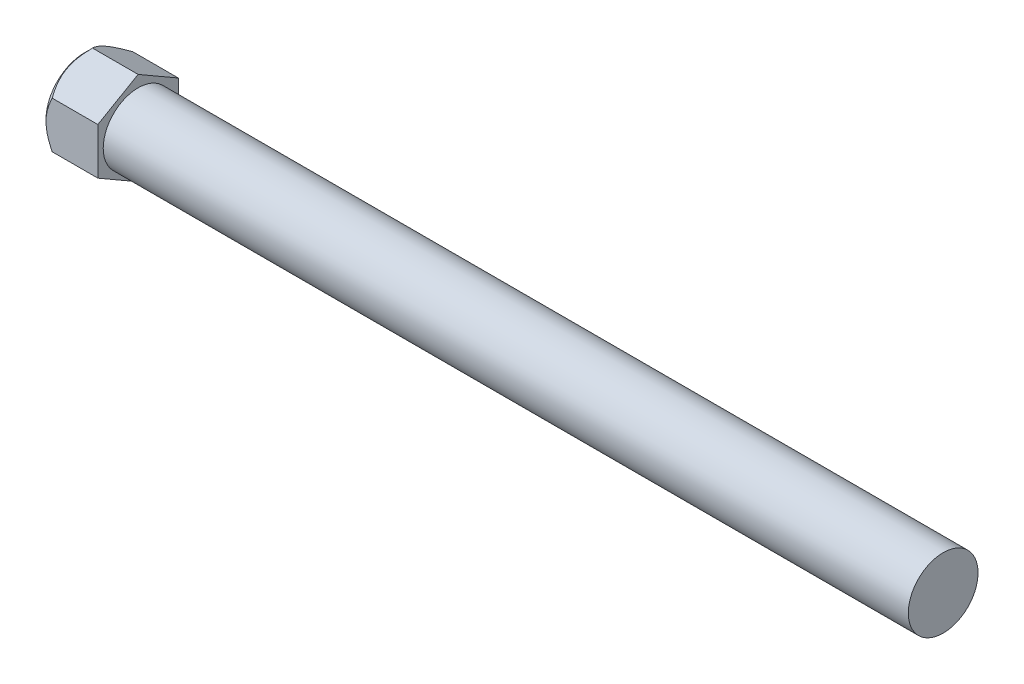
ISO-10303-21;
HEADER;
FILE_DESCRIPTION(('STEP AP214'),'2;1');
FILE_NAME('part.step','',(''),(''),'','','');
FILE_SCHEMA(('AUTOMOTIVE_DESIGN { 1 0 10303 214 1 1 1 1 }'));
ENDSEC;
DATA;
#1=APPLICATION_CONTEXT('core data for automotive mechanical design processes');
#2=APPLICATION_PROTOCOL_DEFINITION('international standard','automotive_design',2000,#1);
#3=PRODUCT_CONTEXT('',#1,'mechanical');
#4=PRODUCT('Part','Part','',(#3));
#5=PRODUCT_RELATED_PRODUCT_CATEGORY('part','',(#4));
#6=PRODUCT_DEFINITION_FORMATION('','',#4);
#7=PRODUCT_DEFINITION_CONTEXT('part definition',#1,'design');
#8=PRODUCT_DEFINITION('design','',#6,#7);
#9=PRODUCT_DEFINITION_SHAPE('','',#8);
#10=(LENGTH_UNIT() NAMED_UNIT(*) SI_UNIT(.MILLI.,.METRE.));
#11=(NAMED_UNIT(*) PLANE_ANGLE_UNIT() SI_UNIT($,.RADIAN.));
#12=(NAMED_UNIT(*) SI_UNIT($,.STERADIAN.) SOLID_ANGLE_UNIT());
#13=UNCERTAINTY_MEASURE_WITH_UNIT(LENGTH_MEASURE(1.E-05),#10,'distance_accuracy_value','');
#14=(GEOMETRIC_REPRESENTATION_CONTEXT(3) GLOBAL_UNCERTAINTY_ASSIGNED_CONTEXT((#13)) GLOBAL_UNIT_ASSIGNED_CONTEXT((#10,
#11,#12)) REPRESENTATION_CONTEXT('',''));
#15=CARTESIAN_POINT('',(0.,0.,0.));
#16=DIRECTION('',(0.,0.,1.));
#17=DIRECTION('',(1.,0.,0.));
#18=AXIS2_PLACEMENT_3D('',#15,#16,#17);
#19=CARTESIAN_POINT('',(5.08,-2.19970452561252,3.80999999999998));
#20=DIRECTION('',(0.,0.866025403784442,-0.499999999999995));
#21=DIRECTION('',(0.,0.499999999999995,0.866025403784442));
#22=AXIS2_PLACEMENT_3D('',#19,#20,#21);
#23=PLANE('',#22);
#24=DIRECTION('',(-1.,0.,0.));
#25=VECTOR('',#24,1.);
#26=CARTESIAN_POINT('',(5.08,-2.19970452561252,3.80999999999998));
#27=LINE('',#26,#25);
#28=CARTESIAN_POINT('',(5.08,-2.19970452561252,3.80999999999998));
#29=VERTEX_POINT('',#28);
#30=CARTESIAN_POINT('',(0.76199999999994,-2.19970452561252,3.80999999999998));
#31=VERTEX_POINT('',#30);
#32=EDGE_CURVE('E122',#29,#31,#27,.T.);
#33=ORIENTED_EDGE('',*,*,#32,.T.);
#34=CARTESIAN_POINT('',(0.762115474599724,-2.19958905555868,3.81019999999998));
#35=CARTESIAN_POINT('',(0.72429461384319,-2.23741368177178,3.74468582562159));
#36=CARTESIAN_POINT('',(0.687634073030057,-2.27552775566492,3.67867031315524));
#37=CARTESIAN_POINT('',(0.616987321907269,-2.35239442339124,3.54553333924474));
#38=CARTESIAN_POINT('',(0.583002572303398,-2.3911473522045,3.47841129759806));
#39=CARTESIAN_POINT('',(0.485302705892566,-2.50881394592998,3.27460677891196));
#40=CARTESIAN_POINT('',(0.426258823375215,-2.58872766346932,3.13619215991211));
#41=CARTESIAN_POINT('',(0.325143092756411,-2.74984883421759,2.85712210600113));
#42=CARTESIAN_POINT('',(0.282816609789215,-2.83101558859985,2.71653716352559));
#43=CARTESIAN_POINT('',(0.217598196192425,-2.99514139983759,2.43226291962837));
#44=CARTESIAN_POINT('',(0.194657606435888,-3.07809543004955,2.28858232460865));
#45=CARTESIAN_POINT('',(0.173959803408106,-3.22106315471624,2.04095496164341));
#46=CARTESIAN_POINT('',(0.170896533818308,-3.28089264638798,1.93732724227694));
#47=CARTESIAN_POINT('',(0.176060056540935,-3.40045452557853,1.73023999287049));
#48=CARTESIAN_POINT('',(0.184290806654918,-3.46018687170908,1.62678053451708));
#49=CARTESIAN_POINT('',(0.211572893911043,-3.57908559078563,1.42084191212165));
#50=CARTESIAN_POINT('',(0.230636333432986,-3.63825125532493,1.318363975076));
#51=CARTESIAN_POINT('',(0.278543161351629,-3.75556644772138,1.11516810134562));
#52=CARTESIAN_POINT('',(0.307385799906258,-3.81371605312778,1.01445003034165));
#53=CARTESIAN_POINT('',(0.366726884497841,-3.91694613462714,0.835650284315285));
#54=CARTESIAN_POINT('',(0.395665168807756,-3.96225515152759,0.757172765002717));
#55=CARTESIAN_POINT('',(0.458205410632379,-4.05205979679576,0.601626556642533));
#56=CARTESIAN_POINT('',(0.491807510083791,-4.09655540036174,0.524557910552823));
#57=CARTESIAN_POINT('',(0.562922095334091,-4.18459303244197,0.372072258811801));
#58=CARTESIAN_POINT('',(0.600422284646797,-4.22813756491547,0.296650916175872));
#59=CARTESIAN_POINT('',(0.678840604939881,-4.31442022588134,0.147204963570726));
#60=CARTESIAN_POINT('',(0.719756638840597,-4.35715882968172,0.073179530343918));
#61=CARTESIAN_POINT('',(0.762115474599705,-4.39952452127879,-0.000199999999999789));
#62=B_SPLINE_CURVE_WITH_KNOTS('',3,(#34,#35,#36,#37,#38,#39,#40,#41,#42,#43,#44,#45,#46,#47,#48,
#49,#50,#51,#52,#53,#54,#55,#56,#57,#58,#59,#60,#61),.UNSPECIFIED.,.F.,.F.,(4,2,2,2,2,2,2,2,2,2,
2,2,2,4),(0.,0.253711067376104,0.507559688133009,1.01799787781203,1.52033002790434,
2.02139753332799,2.37998555140283,2.73869926278797,3.09781452256132,3.45690225258971,
3.74214799282692,4.02740241602428,4.31178284720285,4.59598995563028),.UNSPECIFIED.);
#63=CARTESIAN_POINT('',(0.762,-4.39940905122503,1.36609473733174E-13));
#64=VERTEX_POINT('',#63);
#65=EDGE_CURVE('E62',#31,#64,#62,.T.);
#66=ORIENTED_EDGE('',*,*,#65,.T.);
#67=DIRECTION('',(-1.,0.,0.));
#68=VECTOR('',#67,1.);
#69=CARTESIAN_POINT('',(5.08,-4.39940905122495,0.));
#70=LINE('',#69,#68);
#71=CARTESIAN_POINT('',(5.08,-4.39940905122495,0.));
#72=VERTEX_POINT('',#71);
#73=EDGE_CURVE('E49',#72,#64,#70,.T.);
#74=ORIENTED_EDGE('',*,*,#73,.F.);
#75=DIRECTION('',(0.,-0.499999999999995,-0.866025403784441));
#76=VECTOR('',#75,1.);
#77=CARTESIAN_POINT('',(5.08,-2.19970452561252,3.80999999999998));
#78=LINE('',#77,#76);
#79=EDGE_CURVE('E150',#29,#72,#78,.T.);
#80=ORIENTED_EDGE('',*,*,#79,.F.);
#81=EDGE_LOOP('',(#33,#66,#74,#80));
#82=FACE_BOUND('',#81,.T.);
#83=ADVANCED_FACE('F45',(#82),#23,.F.);
#84=CARTESIAN_POINT('',(5.08,-4.39940905122495,0.));
#85=DIRECTION('',(0.,0.866025403784438,0.500000000000001));
#86=DIRECTION('',(0.,-0.500000000000001,0.866025403784438));
#87=AXIS2_PLACEMENT_3D('',#84,#85,#86);
#88=PLANE('',#87);
#89=ORIENTED_EDGE('',*,*,#73,.T.);
#90=CARTESIAN_POINT('',(0.762115474599704,-4.39952452127879,0.00020000000000005));
#91=CARTESIAN_POINT('',(0.724294613843171,-4.36169989506569,-0.0653141743783903));
#92=CARTESIAN_POINT('',(0.687634073030039,-4.32358582117255,-0.13132968684474));
#93=CARTESIAN_POINT('',(0.61698732190725,-4.24671915344623,-0.264466660755236));
#94=CARTESIAN_POINT('',(0.58300257230338,-4.20796622463297,-0.331588702401909));
#95=CARTESIAN_POINT('',(0.485302705892548,-4.09029963090748,-0.535393221088015));
#96=CARTESIAN_POINT('',(0.426258823375198,-4.01038591336814,-0.673807840087859));
#97=CARTESIAN_POINT('',(0.325143092756394,-3.84926474261988,-0.95287789399884));
#98=CARTESIAN_POINT('',(0.282816609789199,-3.76809798823762,-1.09346283647437));
#99=CARTESIAN_POINT('',(0.217598196192409,-3.60397217699988,-1.3777370803716));
#100=CARTESIAN_POINT('',(0.194657606435873,-3.52101814678792,-1.52141767539131));
#101=CARTESIAN_POINT('',(0.173959803408091,-3.37805042212123,-1.76904503835654));
#102=CARTESIAN_POINT('',(0.170896533818292,-3.31822093044949,-1.87267275772302));
#103=CARTESIAN_POINT('',(0.176060056540919,-3.19865905125893,-2.07976000712946));
#104=CARTESIAN_POINT('',(0.184290806654902,-3.13892670512838,-2.18321946548287));
#105=CARTESIAN_POINT('',(0.211572893911028,-3.02002798605184,-2.3891580878783));
#106=CARTESIAN_POINT('',(0.23063633343297,-2.96086232151253,-2.49163602492395));
#107=CARTESIAN_POINT('',(0.278543161351612,-2.84354712911608,-2.69483189865433));
#108=CARTESIAN_POINT('',(0.307385799906241,-2.78539752370968,-2.7955499696583));
#109=CARTESIAN_POINT('',(0.366726884497826,-2.68216744221032,-2.97434971568467));
#110=CARTESIAN_POINT('',(0.395665168807743,-2.63685842530987,-3.05282723499724));
#111=CARTESIAN_POINT('',(0.458205410632371,-2.54705378004168,-3.20837344335744));
#112=CARTESIAN_POINT('',(0.491807510083786,-2.50255817647571,-3.28544208944715));
#113=CARTESIAN_POINT('',(0.562922095334092,-2.41452054439547,-3.43792774118818));
#114=CARTESIAN_POINT('',(0.600422284646802,-2.37097601192197,-3.51334908382412));
#115=CARTESIAN_POINT('',(0.678840604939893,-2.28469335095608,-3.66279503642927));
#116=CARTESIAN_POINT('',(0.719756638840613,-2.2419547471557,-3.73682046965609));
#117=CARTESIAN_POINT('',(0.762115474599725,-2.19958905555863,-3.81020000000001));
#118=B_SPLINE_CURVE_WITH_KNOTS('',3,(#90,#91,#92,#93,#94,#95,#96,#97,#98,#99,#100,#101,#102,
#103,#104,#105,#106,#107,#108,#109,#110,#111,#112,#113,#114,#115,#116,#117),.UNSPECIFIED.,.F.,
.F.,(4,2,2,2,2,2,2,2,2,2,2,2,2,4),(0.,0.253711067376103,0.507559688133006,1.01799787781202,
1.52033002790433,2.02139753332798,2.37998555140281,2.73869926278795,3.0978145225613,
3.45690225258969,3.74214799282692,4.0274024160243,4.31178284720289,4.59598995563034),.UNSPECIFIED.);
#119=CARTESIAN_POINT('',(0.762,-2.19970452561259,-3.81000000000001));
#120=VERTEX_POINT('',#119);
#121=EDGE_CURVE('E146',#64,#120,#118,.T.);
#122=ORIENTED_EDGE('',*,*,#121,.T.);
#123=DIRECTION('',(-1.,0.,0.));
#124=VECTOR('',#123,1.);
#125=CARTESIAN_POINT('',(5.08,-2.19970452561247,-3.81000000000001));
#126=LINE('',#125,#124);
#127=CARTESIAN_POINT('',(5.08,-2.19970452561247,-3.81000000000001));
#128=VERTEX_POINT('',#127);
#129=EDGE_CURVE('E133',#128,#120,#126,.T.);
#130=ORIENTED_EDGE('',*,*,#129,.F.);
#131=DIRECTION('',(0.,0.500000000000001,-0.866025403784438));
#132=VECTOR('',#131,1.);
#133=CARTESIAN_POINT('',(5.08,-4.39940905122495,0.));
#134=LINE('',#133,#132);
#135=EDGE_CURVE('E147',#72,#128,#134,.T.);
#136=ORIENTED_EDGE('',*,*,#135,.F.);
#137=EDGE_LOOP('',(#89,#122,#130,#136));
#138=FACE_BOUND('',#137,.T.);
#139=ADVANCED_FACE('F145',(#138),#88,.F.);
#140=CARTESIAN_POINT('',(5.08,-2.19970452561247,-3.81000000000001));
#141=DIRECTION('',(0.,0.,1.));
#142=DIRECTION('',(0.,-1.,0.));
#143=AXIS2_PLACEMENT_3D('',#140,#141,#142);
#144=PLANE('',#143);
#145=ORIENTED_EDGE('',*,*,#129,.T.);
#146=CARTESIAN_POINT('',(4.03956213103374,-6.6648170667492,-3.81000000000002));
#147=CARTESIAN_POINT('',(3.95406082681038,-6.56632848536769,-3.81000000000002));
#148=CARTESIAN_POINT('',(3.86882290686694,-6.46761122441616,-3.81000000000002));
#149=CARTESIAN_POINT('',(3.69894774789053,-6.26965853860511,-3.81000000000002));
#150=CARTESIAN_POINT('',(3.61431051870555,-6.17042310529653,-3.81000000000002));
#151=CARTESIAN_POINT('',(3.36133739951288,-5.87176165356924,-3.81000000000002));
#152=CARTESIAN_POINT('',(3.19401884856488,-5.6714709499725,-3.81000000000002));
#153=CARTESIAN_POINT('',(2.85916182354779,-5.26338886415251,-3.81000000000002));
#154=CARTESIAN_POINT('',(2.69170473501833,-5.05553045898891,-3.81000000000002));
#155=CARTESIAN_POINT('',(2.36184013885293,-4.63591596038524,-3.81000000000002));
#156=CARTESIAN_POINT('',(2.1994313784785,-4.42416085501058,-3.81000000000002));
#157=CARTESIAN_POINT('',(1.88134314903491,-3.99516716202927,-3.81000000000001));
#158=CARTESIAN_POINT('',(1.72567276894562,-3.77792175796818,-3.81000000000001));
#159=CARTESIAN_POINT('',(1.49969327393704,-3.44676371790286,-3.81000000000001));
#160=CARTESIAN_POINT('',(1.42558816127823,-3.33544264013408,-3.81000000000001));
#161=CARTESIAN_POINT('',(1.28049200060568,-3.11079115652348,-3.81000000000001));
#162=CARTESIAN_POINT('',(1.2095007423554,-2.99746088706296,-3.81000000000001));
#163=CARTESIAN_POINT('',(1.07185277308869,-2.76934208249685,-3.81000000000001));
#164=CARTESIAN_POINT('',(1.00516762315074,-2.65457078500962,-3.81000000000001));
#165=CARTESIAN_POINT('',(0.876444237195,-2.42241746246675,-3.81000000000001));
#166=CARTESIAN_POINT('',(0.814406561356185,-2.30503512489623,-3.81000000000001));
#167=CARTESIAN_POINT('',(0.696211602679304,-2.06754882746471,-3.81000000000001));
#168=CARTESIAN_POINT('',(0.640045425398874,-1.94744932957305,-3.81000000000001));
#169=CARTESIAN_POINT('',(0.534904724994135,-1.70415080328245,-3.81000000000001));
#170=CARTESIAN_POINT('',(0.485928250805591,-1.58095262643893,-3.81000000000001));
#171=CARTESIAN_POINT('',(0.3958051424024,-1.32850417769837,-3.81));
#172=CARTESIAN_POINT('',(0.354862762356248,-1.19917994964807,-3.81));
#173=CARTESIAN_POINT('',(0.284210019822197,-0.937469048862067,-3.81));
#174=CARTESIAN_POINT('',(0.254497866247267,-0.805082868048361,-3.81));
#175=CARTESIAN_POINT('',(0.208288308708453,-0.538837115078932,-3.81));
#176=CARTESIAN_POINT('',(0.191708890022186,-0.4049920652829,-3.81));
#177=CARTESIAN_POINT('',(0.172673883842266,-0.136293471631276,-3.81));
#178=CARTESIAN_POINT('',(0.170216731764907,-0.00144004115019587,-3.81));
#179=CARTESIAN_POINT('',(0.179624852074243,0.267964703444744,-3.81));
#180=CARTESIAN_POINT('',(0.191512373792489,0.402515223096947,-3.81));
#181=CARTESIAN_POINT('',(0.228739798330087,0.669728471485198,-3.81));
#182=CARTESIAN_POINT('',(0.254082385388346,0.802390818112926,-3.81));
#183=CARTESIAN_POINT('',(0.316770517672946,1.06580474983316,-3.81));
#184=CARTESIAN_POINT('',(0.354200958423346,1.19653576979044,-3.81));
#185=CARTESIAN_POINT('',(0.439023703903418,1.45467415414926,-3.81));
#186=CARTESIAN_POINT('',(0.486416159442973,1.58208146820209,-3.80999999999999));
#187=CARTESIAN_POINT('',(0.600532760549903,1.86108370678088,-3.80999999999999));
#188=CARTESIAN_POINT('',(0.669217761184275,2.0118696886742,-3.80999999999999));
#189=CARTESIAN_POINT('',(0.815755713636707,2.30895760358055,-3.80999999999999));
#190=CARTESIAN_POINT('',(0.893613938953002,2.45525689578664,-3.80999999999999));
#191=CARTESIAN_POINT('',(1.05646367023362,2.74419508783381,-3.80999999999999));
#192=CARTESIAN_POINT('',(1.14146955876612,2.88682581490935,-3.80999999999999));
#193=CARTESIAN_POINT('',(1.31683695925092,3.1686935585584,-3.80999999999999));
#194=CARTESIAN_POINT('',(1.4071974118149,3.30793123879633,-3.80999999999999));
#195=CARTESIAN_POINT('',(1.59259527729437,3.58432725625068,-3.80999999999999));
#196=CARTESIAN_POINT('',(1.68765516160244,3.7214704490006,-3.80999999999999));
#197=CARTESIAN_POINT('',(1.88111176719775,3.99338122358101,-3.80999999999999));
#198=CARTESIAN_POINT('',(1.97950860848708,4.12814871971237,-3.80999999999999));
#199=CARTESIAN_POINT('',(2.17885183034619,4.39553426239854,-3.80999999999999));
#200=CARTESIAN_POINT('',(2.27979509401889,4.52815463882513,-3.80999999999998));
#201=CARTESIAN_POINT('',(2.48384611026831,4.79172210278834,-3.80999999999998));
#202=CARTESIAN_POINT('',(2.58695393362517,4.92266913538143,-3.80999999999998));
#203=CARTESIAN_POINT('',(2.91072605451091,5.32818916644813,-3.80999999999998));
#204=CARTESIAN_POINT('',(3.13444385544103,5.60032540091736,-3.80999999999998));
#205=CARTESIAN_POINT('',(3.47278200503951,6.0036580514061,-3.80999999999998));
#206=CARTESIAN_POINT('',(3.58538654317904,6.13656290440891,-3.80999999999998));
#207=CARTESIAN_POINT('',(3.81169204882211,6.40138559654851,-3.80999999999998));
#208=CARTESIAN_POINT('',(3.92539276924083,6.53330364673627,-3.80999999999998));
#209=CARTESIAN_POINT('',(4.03956213103381,6.66481706674923,-3.80999999999998));
#210=B_SPLINE_CURVE_WITH_KNOTS('',3,(#146,#147,#148,#149,#150,#151,#152,#153,#154,#155,#156,
#157,#158,#159,#160,#161,#162,#163,#164,#165,#166,#167,#168,#169,#170,#171,#172,#173,#174,#175,
#176,#177,#178,#179,#180,#181,#182,#183,#184,#185,#186,#187,#188,#189,#190,#191,#192,#193,#194,
#195,#196,#197,#198,#199,#200,#201,#202,#203,#204,#205,#206,#207,#208,#209),.UNSPECIFIED.,.F.,
.F.,(4,2,2,2,2,2,2,2,2,2,2,2,2,2,2,2,2,2,2,2,2,2,2,2,2,2,2,2,2,2,2,4),(0.,0.391271874886425,
0.782550149706486,1.5654665353666,2.36617212000806,3.16667739775443,3.96823076663962,
4.36938360173619,4.77050931057632,5.16863600891297,5.56681061812657,5.9643730346222,
6.36182736467755,6.76835446944251,7.17481671060233,7.57872010488781,7.98257875048881,
8.38706460773564,8.7916311888467,9.19910327946608,9.60658153904283,10.1032388259304,
10.6001830369557,11.0981522959735,11.5960233597326,12.0965628653486,12.5971203902614,
13.097092399602,13.5970807833489,14.6538243930868,15.1764029991833,15.6988664463307),.UNSPECIFIED.);
#211=CARTESIAN_POINT('',(0.762,2.19970452561247,-3.81000000000003));
#212=VERTEX_POINT('',#211);
#213=EDGE_CURVE('E158',#120,#212,#210,.T.);
#214=ORIENTED_EDGE('',*,*,#213,.T.);
#215=DIRECTION('',(-1.,0.,0.));
#216=VECTOR('',#215,1.);
#217=CARTESIAN_POINT('',(5.08,2.19970452561249,-3.80999999999999));
#218=LINE('',#217,#216);
#219=CARTESIAN_POINT('',(5.08,2.19970452561249,-3.80999999999999));
#220=VERTEX_POINT('',#219);
#221=EDGE_CURVE('E126',#220,#212,#218,.T.);
#222=ORIENTED_EDGE('',*,*,#221,.F.);
#223=DIRECTION('',(0.,1.,0.));
#224=VECTOR('',#223,1.);
#225=CARTESIAN_POINT('',(5.08,-2.19970452561247,-3.81000000000001));
#226=LINE('',#225,#224);
#227=EDGE_CURVE('E323',#128,#220,#226,.T.);
#228=ORIENTED_EDGE('',*,*,#227,.F.);
#229=EDGE_LOOP('',(#145,#214,#222,#228));
#230=FACE_BOUND('',#229,.T.);
#231=ADVANCED_FACE('F205',(#230),#144,.F.);
#232=CARTESIAN_POINT('',(5.08,2.19970452561249,-3.80999999999999));
#233=DIRECTION('',(0.,-0.866025403784442,0.499999999999995));
#234=DIRECTION('',(0.,-0.499999999999995,-0.866025403784442));
#235=AXIS2_PLACEMENT_3D('',#232,#233,#234);
#236=PLANE('',#235);
#237=ORIENTED_EDGE('',*,*,#221,.T.);
#238=CARTESIAN_POINT('',(0.762115474599764,2.19958905555865,-3.81019999999999));
#239=CARTESIAN_POINT('',(0.724294613843231,2.23741368177175,-3.7446858256216));
#240=CARTESIAN_POINT('',(0.687634073030099,2.27552775566489,-3.67867031315525));
#241=CARTESIAN_POINT('',(0.616987321907312,2.35239442339121,-3.54553333924476));
#242=CARTESIAN_POINT('',(0.583002572303442,2.39114735220447,-3.47841129759808));
#243=CARTESIAN_POINT('',(0.485302705892611,2.50881394592996,-3.27460677891197));
#244=CARTESIAN_POINT('',(0.426258823375262,2.5887276634693,-3.13619215991213));
#245=CARTESIAN_POINT('',(0.32514309275646,2.74984883421756,-2.85712210600115));
#246=CARTESIAN_POINT('',(0.282816609789266,2.83101558859982,-2.71653716352561));
#247=CARTESIAN_POINT('',(0.217598196192477,2.99514139983756,-2.43226291962839));
#248=CARTESIAN_POINT('',(0.194657606435941,3.07809543004951,-2.28858232460867));
#249=CARTESIAN_POINT('',(0.173959803408159,3.22106315471621,-2.04095496164344));
#250=CARTESIAN_POINT('',(0.170896533818362,3.28089264638795,-1.93732724227696));
#251=CARTESIAN_POINT('',(0.176060056540989,3.4004545255785,-1.73023999287051));
#252=CARTESIAN_POINT('',(0.184290806654972,3.46018687170905,-1.6267805345171));
#253=CARTESIAN_POINT('',(0.211572893911098,3.5790855907856,-1.42084191212167));
#254=CARTESIAN_POINT('',(0.23063633343304,3.6382512553249,-1.31836397507601));
#255=CARTESIAN_POINT('',(0.278543161351684,3.75556644772136,-1.11516810134563));
#256=CARTESIAN_POINT('',(0.307385799906313,3.81371605312776,-1.01445003034167));
#257=CARTESIAN_POINT('',(0.366726884497899,3.91694613462712,-0.835650284315292));
#258=CARTESIAN_POINT('',(0.395665168807815,3.96225515152757,-0.75717276500272));
#259=CARTESIAN_POINT('',(0.458205410632442,4.05205979679575,-0.60162655664253));
#260=CARTESIAN_POINT('',(0.491807510083855,4.09655540036172,-0.524557910552816));
#261=CARTESIAN_POINT('',(0.562922095334159,4.18459303244196,-0.372072258811787));
#262=CARTESIAN_POINT('',(0.600422284646867,4.22813756491546,-0.296650916175854));
#263=CARTESIAN_POINT('',(0.678840604939955,4.31442022588134,-0.147204963570702));
#264=CARTESIAN_POINT('',(0.719756638840674,4.35715882968172,-0.0731795303438909));
#265=CARTESIAN_POINT('',(0.762115474599784,4.39952452127879,0.000200000000030668));
#266=B_SPLINE_CURVE_WITH_KNOTS('',3,(#238,#239,#240,#241,#242,#243,#244,#245,#246,#247,#248,
#249,#250,#251,#252,#253,#254,#255,#256,#257,#258,#259,#260,#261,#262,#263,#264,#265),
.UNSPECIFIED.,.F.,.F.,(4,2,2,2,2,2,2,2,2,2,2,2,2,4),(0.,0.253711067376102,0.507559688133006,
1.01799787781202,1.52033002790433,2.02139753332798,2.37998555140282,2.73869926278796,
3.09781452256132,3.45690225258971,3.74214799282693,4.0274024160243,4.31178284720289,
4.59598995563034),.UNSPECIFIED.);
#267=CARTESIAN_POINT('',(0.762,4.39940905122495,0.));
#268=VERTEX_POINT('',#267);
#269=EDGE_CURVE('E118',#212,#268,#266,.T.);
#270=ORIENTED_EDGE('',*,*,#269,.T.);
#271=DIRECTION('',(-1.,0.,0.));
#272=VECTOR('',#271,1.);
#273=CARTESIAN_POINT('',(5.08,4.39940905122495,0.));
#274=LINE('',#273,#272);
#275=CARTESIAN_POINT('',(5.08,4.39940905122495,0.));
#276=VERTEX_POINT('',#275);
#277=EDGE_CURVE('E116',#276,#268,#274,.T.);
#278=ORIENTED_EDGE('',*,*,#277,.F.);
#279=DIRECTION('',(0.,0.499999999999995,0.866025403784441));
#280=VECTOR('',#279,1.);
#281=CARTESIAN_POINT('',(5.08,2.19970452561249,-3.80999999999999));
#282=LINE('',#281,#280);
#283=EDGE_CURVE('E328',#220,#276,#282,.T.);
#284=ORIENTED_EDGE('',*,*,#283,.F.);
#285=EDGE_LOOP('',(#237,#270,#278,#284));
#286=FACE_BOUND('',#285,.T.);
#287=ADVANCED_FACE('F208',(#286),#236,.F.);
#288=CARTESIAN_POINT('',(5.08,4.39940905122495,0.));
#289=DIRECTION('',(0.,-0.866025403784434,-0.500000000000007));
#290=DIRECTION('',(0.,0.500000000000007,-0.866025403784435));
#291=AXIS2_PLACEMENT_3D('',#288,#289,#290);
#292=PLANE('',#291);
#293=ORIENTED_EDGE('',*,*,#277,.T.);
#294=CARTESIAN_POINT('',(0.762115474599783,4.39952452127879,-0.000199999999969328));
#295=CARTESIAN_POINT('',(0.724294613843249,4.36169989506569,0.065314174378422));
#296=CARTESIAN_POINT('',(0.687634073030116,4.32358582117255,0.131329686844772));
#297=CARTESIAN_POINT('',(0.616987321907327,4.24671915344623,0.26446666075527));
#298=CARTESIAN_POINT('',(0.583002572303456,4.20796622463296,0.331588702401944));
#299=CARTESIAN_POINT('',(0.485302705892622,4.09029963090748,0.535393221088053));
#300=CARTESIAN_POINT('',(0.426258823375271,4.01038591336813,0.673807840087899));
#301=CARTESIAN_POINT('',(0.325143092756465,3.84926474261986,0.952877893998885));
#302=CARTESIAN_POINT('',(0.28281660978927,3.7680979882376,1.09346283647442));
#303=CARTESIAN_POINT('',(0.217598196192479,3.60397217699985,1.37773708037165));
#304=CARTESIAN_POINT('',(0.194657606435942,3.52101814678789,1.52141767539136));
#305=CARTESIAN_POINT('',(0.173959803408159,3.37805042212119,1.7690450383566));
#306=CARTESIAN_POINT('',(0.170896533818361,3.31822093044945,1.87267275772307));
#307=CARTESIAN_POINT('',(0.176060056540988,3.1986590512589,2.07976000712952));
#308=CARTESIAN_POINT('',(0.184290806654971,3.13892670512834,2.18321946548293));
#309=CARTESIAN_POINT('',(0.211572893911097,3.02002798605179,2.38915808787837));
#310=CARTESIAN_POINT('',(0.23063633343304,2.96086232151249,2.49163602492402));
#311=CARTESIAN_POINT('',(0.278543161351683,2.84354712911603,2.6948318986544));
#312=CARTESIAN_POINT('',(0.307385799906312,2.78539752370963,2.79554996965837));
#313=CARTESIAN_POINT('',(0.366726884497896,2.68216744221027,2.97434971568474));
#314=CARTESIAN_POINT('',(0.395665168807812,2.63685842530982,3.0528272349973));
#315=CARTESIAN_POINT('',(0.458205410632436,2.54705378004164,3.20837344335749));
#316=CARTESIAN_POINT('',(0.491807510083847,2.50255817647567,3.2854420894472));
#317=CARTESIAN_POINT('',(0.562922095334148,2.41452054439543,3.43792774118822));
#318=CARTESIAN_POINT('',(0.600422284646855,2.37097601192193,3.51334908382415));
#319=CARTESIAN_POINT('',(0.67884060493994,2.28469335095605,3.6627950364293));
#320=CARTESIAN_POINT('',(0.719756638840656,2.24195474715567,3.7368204696561));
#321=CARTESIAN_POINT('',(0.762115474599764,2.1995890555586,3.81020000000002));
#322=B_SPLINE_CURVE_WITH_KNOTS('',3,(#294,#295,#296,#297,#298,#299,#300,#301,#302,#303,#304,
#305,#306,#307,#308,#309,#310,#311,#312,#313,#314,#315,#316,#317,#318,#319,#320,#321),
.UNSPECIFIED.,.F.,.F.,(4,2,2,2,2,2,2,2,2,2,2,2,2,4),(0.,0.253711067376107,0.507559688133014,
1.01799787781204,1.52033002790436,2.02139753332801,2.37998555140286,2.738699262788,
3.09781452256136,3.45690225258975,3.74214799282697,4.02740241602433,4.3117828472029,
4.59598995563033),.UNSPECIFIED.);
#323=CARTESIAN_POINT('',(0.762,2.19970452561248,3.81000000000002));
#324=VERTEX_POINT('',#323);
#325=EDGE_CURVE('E101',#268,#324,#322,.T.);
#326=ORIENTED_EDGE('',*,*,#325,.T.);
#327=DIRECTION('',(-1.,0.,0.));
#328=VECTOR('',#327,1.);
#329=CARTESIAN_POINT('',(5.08,2.19970452561244,3.81000000000002));
#330=LINE('',#329,#328);
#331=CARTESIAN_POINT('',(5.08,2.19970452561244,3.81000000000002));
#332=VERTEX_POINT('',#331);
#333=EDGE_CURVE('E114',#332,#324,#330,.T.);
#334=ORIENTED_EDGE('',*,*,#333,.F.);
#335=DIRECTION('',(0.,-0.500000000000007,0.866025403784435));
#336=VECTOR('',#335,1.);
#337=CARTESIAN_POINT('',(5.08,4.39940905122495,0.));
#338=LINE('',#337,#336);
#339=EDGE_CURVE('E331',#276,#332,#338,.T.);
#340=ORIENTED_EDGE('',*,*,#339,.F.);
#341=EDGE_LOOP('',(#293,#326,#334,#340));
#342=FACE_BOUND('',#341,.T.);
#343=ADVANCED_FACE('F112',(#342),#292,.F.);
#344=CARTESIAN_POINT('',(5.08,2.19970452561244,3.81000000000002));
#345=DIRECTION('',(0.,0.,-1.));
#346=DIRECTION('',(0.,1.,0.));
#347=AXIS2_PLACEMENT_3D('',#344,#345,#346);
#348=PLANE('',#347);
#349=ORIENTED_EDGE('',*,*,#333,.T.);
#350=CARTESIAN_POINT('',(4.03956213103381,6.66481706674918,3.81000000000007));
#351=CARTESIAN_POINT('',(3.95406082681045,6.56632848536767,3.81000000000007));
#352=CARTESIAN_POINT('',(3.86882290686701,6.46761122441614,3.81000000000007));
#353=CARTESIAN_POINT('',(3.6989477478906,6.26965853860508,3.81000000000006));
#354=CARTESIAN_POINT('',(3.61431051870561,6.1704231052965,3.81000000000006));
#355=CARTESIAN_POINT('',(3.36133739951294,5.87176165356921,3.81000000000006));
#356=CARTESIAN_POINT('',(3.19401884856494,5.67147094997246,3.81000000000006));
#357=CARTESIAN_POINT('',(2.85916182354785,5.26338886415247,3.81000000000005));
#358=CARTESIAN_POINT('',(2.69170473501839,5.05553045898887,3.81000000000005));
#359=CARTESIAN_POINT('',(2.36184013885298,4.6359159603852,3.81000000000005));
#360=CARTESIAN_POINT('',(2.19943137847855,4.42416085501053,3.81000000000005));
#361=CARTESIAN_POINT('',(1.88134314903496,3.99516716202922,3.81000000000004));
#362=CARTESIAN_POINT('',(1.72567276894566,3.77792175796813,3.81000000000004));
#363=CARTESIAN_POINT('',(1.49969327393708,3.44676371790281,3.81000000000004));
#364=CARTESIAN_POINT('',(1.42558816127826,3.33544264013402,3.81000000000003));
#365=CARTESIAN_POINT('',(1.28049200060571,3.11079115652342,3.81000000000003));
#366=CARTESIAN_POINT('',(1.20950074235543,2.99746088706291,3.81000000000003));
#367=CARTESIAN_POINT('',(1.07185277308872,2.76934208249679,3.81000000000003));
#368=CARTESIAN_POINT('',(1.00516762315076,2.65457078500956,3.81000000000003));
#369=CARTESIAN_POINT('',(0.876444237195024,2.42241746246669,3.81000000000002));
#370=CARTESIAN_POINT('',(0.814406561356209,2.30503512489617,3.81000000000002));
#371=CARTESIAN_POINT('',(0.696211602679325,2.06754882746464,3.81000000000002));
#372=CARTESIAN_POINT('',(0.640045425398894,1.94744932957299,3.81000000000002));
#373=CARTESIAN_POINT('',(0.534904724994151,1.70415080328238,3.81000000000002));
#374=CARTESIAN_POINT('',(0.485928250805607,1.58095262643886,3.81000000000002));
#375=CARTESIAN_POINT('',(0.395805142402412,1.3285041776983,3.81000000000001));
#376=CARTESIAN_POINT('',(0.354862762356259,1.199179949648,3.81000000000001));
#377=CARTESIAN_POINT('',(0.284210019822205,0.937469048861996,3.81000000000001));
#378=CARTESIAN_POINT('',(0.254497866247273,0.805082868048288,3.81000000000001));
#379=CARTESIAN_POINT('',(0.208288308708457,0.538837115078857,3.81000000000001));
#380=CARTESIAN_POINT('',(0.191708890022188,0.404992065282825,3.81));
#381=CARTESIAN_POINT('',(0.172673883842266,0.136293471631198,3.81));
#382=CARTESIAN_POINT('',(0.170216731764907,0.0014400411501158,3.81));
#383=CARTESIAN_POINT('',(0.17962485207424,-0.267964703444827,3.81));
#384=CARTESIAN_POINT('',(0.191512373792486,-0.402515223097032,3.81));
#385=CARTESIAN_POINT('',(0.228739798330083,-0.669728471485286,3.80999999999999));
#386=CARTESIAN_POINT('',(0.254082385388342,-0.802390818113016,3.80999999999999));
#387=CARTESIAN_POINT('',(0.316770517672942,-1.06580474983326,3.80999999999999));
#388=CARTESIAN_POINT('',(0.354200958423341,-1.19653576979053,3.80999999999999));
#389=CARTESIAN_POINT('',(0.439023703903413,-1.45467415414936,3.80999999999998));
#390=CARTESIAN_POINT('',(0.48641615944297,-1.58208146820218,3.80999999999998));
#391=CARTESIAN_POINT('',(0.6005327605499,-1.86108370678097,3.80999999999998));
#392=CARTESIAN_POINT('',(0.669217761184271,-2.0118696886743,3.80999999999998));
#393=CARTESIAN_POINT('',(0.815755713636701,-2.30895760358065,3.80999999999998));
#394=CARTESIAN_POINT('',(0.893613938952995,-2.45525689578674,3.80999999999997));
#395=CARTESIAN_POINT('',(1.05646367023361,-2.7441950878339,3.80999999999997));
#396=CARTESIAN_POINT('',(1.14146955876611,-2.88682581490944,3.80999999999997));
#397=CARTESIAN_POINT('',(1.31683695925091,-3.16869355855849,3.80999999999997));
#398=CARTESIAN_POINT('',(1.40719741181489,-3.30793123879642,3.80999999999996));
#399=CARTESIAN_POINT('',(1.59259527729436,-3.58432725625077,3.80999999999996));
#400=CARTESIAN_POINT('',(1.68765516160243,-3.72147044900069,3.80999999999996));
#401=CARTESIAN_POINT('',(1.88111176719773,-3.9933812235811,3.80999999999996));
#402=CARTESIAN_POINT('',(1.97950860848707,-4.12814871971246,3.80999999999996));
#403=CARTESIAN_POINT('',(2.17885183034617,-4.39553426239863,3.80999999999995));
#404=CARTESIAN_POINT('',(2.27979509401887,-4.52815463882521,3.80999999999995));
#405=CARTESIAN_POINT('',(2.48384611026829,-4.79172210278842,3.80999999999995));
#406=CARTESIAN_POINT('',(2.58695393362515,-4.92266913538151,3.80999999999995));
#407=CARTESIAN_POINT('',(2.91072605451088,-5.3281891664482,3.80999999999994));
#408=CARTESIAN_POINT('',(3.13444385544099,-5.60032540091742,3.80999999999994));
#409=CARTESIAN_POINT('',(3.47278200503946,-6.00365805140615,3.80999999999994));
#410=CARTESIAN_POINT('',(3.58538654317899,-6.13656290440895,3.80999999999994));
#411=CARTESIAN_POINT('',(3.81169204882205,-6.40138559654854,3.80999999999993));
#412=CARTESIAN_POINT('',(3.92539276924076,-6.53330364673631,3.80999999999993));
#413=CARTESIAN_POINT('',(4.03956213103374,-6.66481706674925,3.80999999999993));
#414=B_SPLINE_CURVE_WITH_KNOTS('',3,(#350,#351,#352,#353,#354,#355,#356,#357,#358,#359,#360,
#361,#362,#363,#364,#365,#366,#367,#368,#369,#370,#371,#372,#373,#374,#375,#376,#377,#378,#379,
#380,#381,#382,#383,#384,#385,#386,#387,#388,#389,#390,#391,#392,#393,#394,#395,#396,#397,#398,
#399,#400,#401,#402,#403,#404,#405,#406,#407,#408,#409,#410,#411,#412,#413),.UNSPECIFIED.,.F.,
.F.,(4,2,2,2,2,2,2,2,2,2,2,2,2,2,2,2,2,2,2,2,2,2,2,2,2,2,2,2,2,2,2,4),(0.,0.39127187488643,
0.782550149706497,1.56546653536661,2.36617212000808,3.16667739775447,3.96823076663966,
4.36938360173623,4.77050931057637,5.16863600891302,5.56681061812663,5.96437303462226,
6.36182736467762,6.76835446944258,7.1748167106024,7.57872010488789,7.98257875048889,
8.38706460773572,8.79163118884679,9.19910327946618,9.60658153904293,10.1032388259305,
10.6001830369558,11.0981522959736,11.5960233597326,12.0965628653487,12.5971203902615,
13.097092399602,13.597080783349,14.6538243930868,15.1764029991833,15.6988664463307),.UNSPECIFIED.);
#415=EDGE_CURVE('E98',#324,#31,#414,.T.);
#416=ORIENTED_EDGE('',*,*,#415,.T.);
#417=ORIENTED_EDGE('',*,*,#32,.F.);
#418=DIRECTION('',(0.,-1.,0.));
#419=VECTOR('',#418,1.);
#420=CARTESIAN_POINT('',(5.08,2.19970452561244,3.81000000000002));
#421=LINE('',#420,#419);
#422=EDGE_CURVE('E70',#332,#29,#421,.T.);
#423=ORIENTED_EDGE('',*,*,#422,.F.);
#424=EDGE_LOOP('',(#349,#416,#417,#423));
#425=FACE_BOUND('',#424,.T.);
#426=ADVANCED_FACE('F120',(#425),#348,.F.);
#427=CARTESIAN_POINT('',(5.08,0.,0.));
#428=DIRECTION('',(1.,0.,0.));
#429=DIRECTION('',(0.,0.,-1.));
#430=AXIS2_PLACEMENT_3D('',#427,#428,#429);
#431=PLANE('',#430);
#432=CARTESIAN_POINT('',(5.08,0.,0.));
#433=DIRECTION('',(1.,0.,0.));
#434=DIRECTION('',(0.,0.,-1.));
#435=AXIS2_PLACEMENT_3D('',#432,#433,#434);
#436=CIRCLE('',#435,3.302);
#437=CARTESIAN_POINT('',(5.08,0.,3.302));
#438=VERTEX_POINT('',#437);
#439=EDGE_CURVE('E12',#438,#438,#436,.T.);
#440=ORIENTED_EDGE('',*,*,#439,.F.);
#441=EDGE_LOOP('',(#440));
#442=FACE_BOUND('',#441,.T.);
#443=ORIENTED_EDGE('',*,*,#79,.T.);
#444=ORIENTED_EDGE('',*,*,#135,.T.);
#445=ORIENTED_EDGE('',*,*,#227,.T.);
#446=ORIENTED_EDGE('',*,*,#283,.T.);
#447=ORIENTED_EDGE('',*,*,#339,.T.);
#448=ORIENTED_EDGE('',*,*,#422,.T.);
#449=EDGE_LOOP('',(#443,#444,#445,#446,#447,#448));
#450=FACE_BOUND('',#449,.T.);
#451=ADVANCED_FACE('F261',(#442,#450),#431,.T.);
#452=CARTESIAN_POINT('',(81.28,0.,0.));
#453=DIRECTION('',(-1.,0.,0.));
#454=DIRECTION('',(0.,0.,1.));
#455=AXIS2_PLACEMENT_3D('',#452,#453,#454);
#456=CYLINDRICAL_SURFACE('',#455,3.302);
#457=CARTESIAN_POINT('',(81.28,0.,0.));
#458=DIRECTION('',(1.,0.,0.));
#459=DIRECTION('',(0.,0.,-1.));
#460=AXIS2_PLACEMENT_3D('',#457,#458,#459);
#461=CIRCLE('',#460,3.302);
#462=CARTESIAN_POINT('',(81.28,0.,3.302));
#463=VERTEX_POINT('',#462);
#464=EDGE_CURVE('E152',#463,#463,#461,.T.);
#465=CARTESIAN_POINT('',(81.28,0.,3.302));
#466=CARTESIAN_POINT('',(80.48625,0.,3.302));
#467=CARTESIAN_POINT('',(79.6925,0.,3.302));
#468=CARTESIAN_POINT('',(78.105,0.,3.302));
#469=CARTESIAN_POINT('',(77.31125,0.,3.302));
#470=CARTESIAN_POINT('',(75.72375,0.,3.302));
#471=CARTESIAN_POINT('',(74.93,0.,3.302));
#472=CARTESIAN_POINT('',(73.3425,0.,3.302));
#473=CARTESIAN_POINT('',(72.54875,0.,3.302));
#474=CARTESIAN_POINT('',(70.96125,0.,3.302));
#475=CARTESIAN_POINT('',(70.1675,0.,3.302));
#476=CARTESIAN_POINT('',(68.58,0.,3.302));
#477=CARTESIAN_POINT('',(67.78625,0.,3.302));
#478=CARTESIAN_POINT('',(66.19875,0.,3.302));
#479=CARTESIAN_POINT('',(65.405,0.,3.302));
#480=CARTESIAN_POINT('',(63.8175,0.,3.302));
#481=CARTESIAN_POINT('',(63.02375,0.,3.302));
#482=CARTESIAN_POINT('',(61.43625,0.,3.302));
#483=CARTESIAN_POINT('',(60.6425,0.,3.302));
#484=CARTESIAN_POINT('',(59.055,0.,3.302));
#485=CARTESIAN_POINT('',(58.26125,0.,3.302));
#486=CARTESIAN_POINT('',(56.67375,0.,3.302));
#487=CARTESIAN_POINT('',(55.88,0.,3.302));
#488=CARTESIAN_POINT('',(54.2925,0.,3.302));
#489=CARTESIAN_POINT('',(53.49875,0.,3.302));
#490=CARTESIAN_POINT('',(51.91125,0.,3.302));
#491=CARTESIAN_POINT('',(51.1175,0.,3.302));
#492=CARTESIAN_POINT('',(49.53,0.,3.302));
#493=CARTESIAN_POINT('',(48.73625,0.,3.302));
#494=CARTESIAN_POINT('',(47.14875,0.,3.302));
#495=CARTESIAN_POINT('',(46.355,0.,3.302));
#496=CARTESIAN_POINT('',(44.7675,0.,3.302));
#497=CARTESIAN_POINT('',(43.97375,0.,3.302));
#498=CARTESIAN_POINT('',(42.38625,0.,3.302));
#499=CARTESIAN_POINT('',(41.5925,0.,3.302));
#500=CARTESIAN_POINT('',(40.005,0.,3.302));
#501=CARTESIAN_POINT('',(39.21125,0.,3.302));
#502=CARTESIAN_POINT('',(37.62375,0.,3.302));
#503=CARTESIAN_POINT('',(36.83,0.,3.302));
#504=CARTESIAN_POINT('',(35.2425,0.,3.302));
#505=CARTESIAN_POINT('',(34.44875,0.,3.302));
#506=CARTESIAN_POINT('',(32.86125,0.,3.302));
#507=CARTESIAN_POINT('',(32.0675,0.,3.302));
#508=CARTESIAN_POINT('',(30.48,0.,3.302));
#509=CARTESIAN_POINT('',(29.68625,0.,3.302));
#510=CARTESIAN_POINT('',(28.09875,0.,3.302));
#511=CARTESIAN_POINT('',(27.305,0.,3.302));
#512=CARTESIAN_POINT('',(25.7175,0.,3.302));
#513=CARTESIAN_POINT('',(24.92375,0.,3.302));
#514=CARTESIAN_POINT('',(23.33625,0.,3.302));
#515=CARTESIAN_POINT('',(22.5425,0.,3.302));
#516=CARTESIAN_POINT('',(20.955,0.,3.302));
#517=CARTESIAN_POINT('',(20.16125,0.,3.302));
#518=CARTESIAN_POINT('',(18.57375,0.,3.302));
#519=CARTESIAN_POINT('',(17.78,0.,3.302));
#520=CARTESIAN_POINT('',(16.1925,0.,3.302));
#521=CARTESIAN_POINT('',(15.39875,0.,3.302));
#522=CARTESIAN_POINT('',(13.81125,0.,3.302));
#523=CARTESIAN_POINT('',(13.0175,0.,3.302));
#524=CARTESIAN_POINT('',(11.43,0.,3.302));
#525=CARTESIAN_POINT('',(10.63625,0.,3.302));
#526=CARTESIAN_POINT('',(9.04875,0.,3.302));
#527=CARTESIAN_POINT('',(8.255,0.,3.302));
#528=CARTESIAN_POINT('',(6.6675,0.,3.302));
#529=CARTESIAN_POINT('',(5.87375,0.,3.302));
#530=CARTESIAN_POINT('',(5.08,0.,3.302));
#531=B_SPLINE_CURVE_WITH_KNOTS('',3,(#465,#466,#467,#468,#469,#470,#471,#472,#473,#474,#475,
#476,#477,#478,#479,#480,#481,#482,#483,#484,#485,#486,#487,#488,#489,#490,#491,#492,#493,#494,
#495,#496,#497,#498,#499,#500,#501,#502,#503,#504,#505,#506,#507,#508,#509,#510,#511,#512,#513,
#514,#515,#516,#517,#518,#519,#520,#521,#522,#523,#524,#525,#526,#527,#528,#529,#530),
.UNSPECIFIED.,.F.,.F.,(4,2,2,2,2,2,2,2,2,2,2,2,2,2,2,2,2,2,2,2,2,2,2,2,2,2,2,2,2,2,2,2,4),(0.,
2.38125,4.7625,7.14375,9.52500000000001,11.90625,14.2875,16.66875,19.05,21.43125,23.8125,
26.19375,28.575,30.95625,33.3375,35.71875,38.1,40.48125,42.8625,45.24375,47.625,50.00625,
52.3875,54.76875,57.15,59.53125,61.9125,64.29375,66.675,69.05625,71.4375,73.81875,76.2),.UNSPECIFIED.);
#532=EDGE_CURVE('BSEAM289',#463,#438,#531,.T.);
#533=ORIENTED_EDGE('',*,*,#464,.F.);
#534=ORIENTED_EDGE('',*,*,#439,.T.);
#535=ORIENTED_EDGE('',*,*,#532,.T.);
#536=ORIENTED_EDGE('',*,*,#532,.F.);
#537=EDGE_LOOP('',(#533,#535,#534,#536));
#538=FACE_BOUND('',#537,.T.);
#539=ADVANCED_FACE('F289',(#538),#456,.T.);
#540=CARTESIAN_POINT('',(81.28,0.,0.));
#541=DIRECTION('',(1.,0.,0.));
#542=DIRECTION('',(0.,0.,-1.));
#543=AXIS2_PLACEMENT_3D('',#540,#541,#542);
#544=PLANE('',#543);
#545=ORIENTED_EDGE('',*,*,#464,.T.);
#546=EDGE_LOOP('',(#545));
#547=FACE_BOUND('',#546,.T.);
#548=ADVANCED_FACE('F174',(#547),#544,.T.);
#549=CARTESIAN_POINT('',(0.762,0.,0.));
#550=DIRECTION('',(1.,0.,0.));
#551=DIRECTION('',(0.,0.,-1.));
#552=AXIS2_PLACEMENT_3D('',#549,#550,#551);
#553=CONICAL_SURFACE('',#552,4.39940905122499,0.785398163397448);
#554=CARTESIAN_POINT('',(0.,0.,0.));
#555=DIRECTION('',(-1.,0.,0.));
#556=DIRECTION('',(0.,0.,1.));
#557=AXIS2_PLACEMENT_3D('',#554,#555,#556);
#558=CIRCLE('',#557,3.63740905122499);
#559=CARTESIAN_POINT('',(0.,0.,3.63740905122499));
#560=VERTEX_POINT('',#559);
#561=EDGE_CURVE('E107',#560,#560,#558,.T.);
#562=ORIENTED_EDGE('',*,*,#561,.F.);
#563=EDGE_LOOP('',(#562));
#564=FACE_BOUND('',#563,.T.);
#565=ORIENTED_EDGE('',*,*,#415,.F.);
#566=ORIENTED_EDGE('',*,*,#325,.F.);
#567=ORIENTED_EDGE('',*,*,#269,.F.);
#568=ORIENTED_EDGE('',*,*,#213,.F.);
#569=ORIENTED_EDGE('',*,*,#121,.F.);
#570=ORIENTED_EDGE('',*,*,#65,.F.);
#571=EDGE_LOOP('',(#565,#566,#567,#568,#569,#570));
#572=FACE_BOUND('',#571,.T.);
#573=ADVANCED_FACE('F100',(#564,#572),#553,.T.);
#574=CARTESIAN_POINT('',(0.,0.,0.));
#575=DIRECTION('',(1.,0.,0.));
#576=DIRECTION('',(0.,0.,-1.));
#577=AXIS2_PLACEMENT_3D('',#574,#575,#576);
#578=PLANE('',#577);
#579=ORIENTED_EDGE('',*,*,#561,.T.);
#580=EDGE_LOOP('',(#579));
#581=FACE_BOUND('',#580,.T.);
#582=ADVANCED_FACE('F173',(#581),#578,.F.);
#583=CLOSED_SHELL('',(#83,#139,#231,#287,#343,#426,#451,#539,#548,#573,#582));
#584=MANIFOLD_SOLID_BREP('B2',#583);
#585=ADVANCED_BREP_SHAPE_REPRESENTATION('',(#18,#584),#14);
#586=SHAPE_DEFINITION_REPRESENTATION(#9,#585);
ENDSEC;
END-ISO-10303-21;
